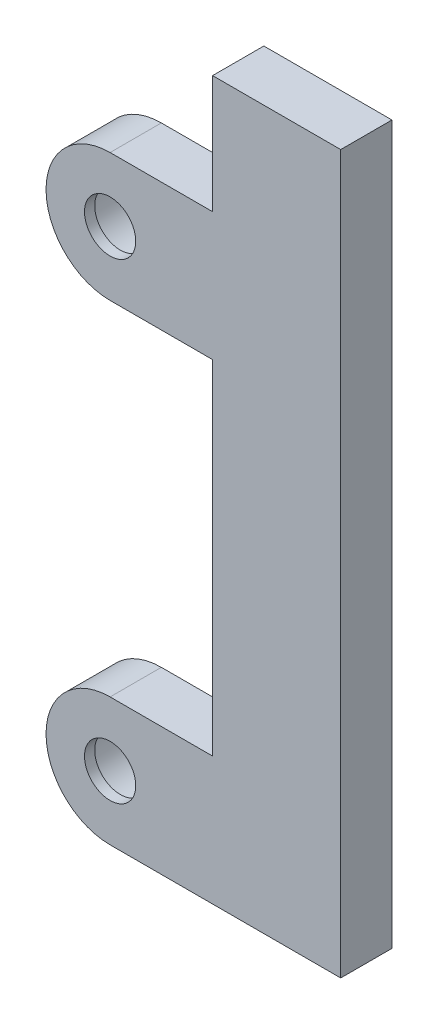
ISO-10303-21;
HEADER;
FILE_DESCRIPTION(('STEP AP214'),'2;1');
FILE_NAME('part.step','',(''),(''),'','','');
FILE_SCHEMA(('AUTOMOTIVE_DESIGN { 1 0 10303 214 1 1 1 1 }'));
ENDSEC;
DATA;
#1=APPLICATION_CONTEXT('core data for automotive mechanical design processes');
#2=APPLICATION_PROTOCOL_DEFINITION('international standard','automotive_design',2000,#1);
#3=PRODUCT_CONTEXT('',#1,'mechanical');
#4=PRODUCT('Part','Part','',(#3));
#5=PRODUCT_RELATED_PRODUCT_CATEGORY('part','',(#4));
#6=PRODUCT_DEFINITION_FORMATION('','',#4);
#7=PRODUCT_DEFINITION_CONTEXT('part definition',#1,'design');
#8=PRODUCT_DEFINITION('design','',#6,#7);
#9=PRODUCT_DEFINITION_SHAPE('','',#8);
#10=(LENGTH_UNIT() NAMED_UNIT(*) SI_UNIT(.MILLI.,.METRE.));
#11=(NAMED_UNIT(*) PLANE_ANGLE_UNIT() SI_UNIT($,.RADIAN.));
#12=(NAMED_UNIT(*) SI_UNIT($,.STERADIAN.) SOLID_ANGLE_UNIT());
#13=UNCERTAINTY_MEASURE_WITH_UNIT(LENGTH_MEASURE(1.E-05),#10,'distance_accuracy_value','');
#14=(GEOMETRIC_REPRESENTATION_CONTEXT(3) GLOBAL_UNCERTAINTY_ASSIGNED_CONTEXT((#13)) GLOBAL_UNIT_ASSIGNED_CONTEXT((#10,
#11,#12)) REPRESENTATION_CONTEXT('',''));
#15=CARTESIAN_POINT('',(0.,0.,0.));
#16=DIRECTION('',(0.,0.,1.));
#17=DIRECTION('',(1.,0.,0.));
#18=AXIS2_PLACEMENT_3D('',#15,#16,#17);
#19=CARTESIAN_POINT('',(0.,0.,-10.));
#20=DIRECTION('',(0.,0.,1.));
#21=DIRECTION('',(-1.,0.,0.));
#22=AXIS2_PLACEMENT_3D('',#19,#20,#21);
#23=CYLINDRICAL_SURFACE('',#22,5.);
#24=CARTESIAN_POINT('',(0.,0.,0.));
#25=DIRECTION('',(0.,0.,1.));
#26=DIRECTION('',(1.,0.,0.));
#27=AXIS2_PLACEMENT_3D('',#24,#25,#26);
#28=CIRCLE('',#27,5.);
#29=CARTESIAN_POINT('',(5.,0.,0.));
#30=VERTEX_POINT('',#29);
#31=EDGE_CURVE('E154',#30,#30,#28,.T.);
#32=ORIENTED_EDGE('',*,*,#31,.T.);
#33=EDGE_LOOP('',(#32));
#34=FACE_BOUND('',#33,.T.);
#35=CARTESIAN_POINT('',(0.,0.,-2.));
#36=DIRECTION('',(0.,0.,1.));
#37=DIRECTION('',(1.,0.,0.));
#38=AXIS2_PLACEMENT_3D('',#35,#36,#37);
#39=CIRCLE('',#38,5.);
#40=CARTESIAN_POINT('',(5.,0.,-2.));
#41=VERTEX_POINT('',#40);
#42=EDGE_CURVE('E43',#41,#41,#39,.T.);
#43=ORIENTED_EDGE('',*,*,#42,.F.);
#44=EDGE_LOOP('',(#43));
#45=FACE_BOUND('',#44,.T.);
#46=ADVANCED_FACE('F39',(#34,#45),#23,.F.);
#47=CARTESIAN_POINT('',(0.,92.,-10.));
#48=DIRECTION('',(0.,0.,1.));
#49=DIRECTION('',(-1.,0.,0.));
#50=AXIS2_PLACEMENT_3D('',#47,#48,#49);
#51=CYLINDRICAL_SURFACE('',#50,5.);
#52=CARTESIAN_POINT('',(0.,92.,0.));
#53=DIRECTION('',(0.,0.,1.));
#54=DIRECTION('',(1.,0.,0.));
#55=AXIS2_PLACEMENT_3D('',#52,#53,#54);
#56=CIRCLE('',#55,5.);
#57=CARTESIAN_POINT('',(5.,92.,0.));
#58=VERTEX_POINT('',#57);
#59=EDGE_CURVE('E195',#58,#58,#56,.T.);
#60=ORIENTED_EDGE('',*,*,#59,.T.);
#61=EDGE_LOOP('',(#60));
#62=FACE_BOUND('',#61,.T.);
#63=CARTESIAN_POINT('',(0.,92.,-2.));
#64=DIRECTION('',(0.,0.,1.));
#65=DIRECTION('',(1.,0.,0.));
#66=AXIS2_PLACEMENT_3D('',#63,#64,#65);
#67=CIRCLE('',#66,5.);
#68=CARTESIAN_POINT('',(5.,92.,-2.));
#69=VERTEX_POINT('',#68);
#70=EDGE_CURVE('E189',#69,#69,#67,.T.);
#71=ORIENTED_EDGE('',*,*,#70,.F.);
#72=EDGE_LOOP('',(#71));
#73=FACE_BOUND('',#72,.T.);
#74=ADVANCED_FACE('F256',(#62,#73),#51,.F.);
#75=CARTESIAN_POINT('',(0.,92.,-10.));
#76=DIRECTION('',(0.,0.,-1.));
#77=DIRECTION('',(1.,0.,0.));
#78=AXIS2_PLACEMENT_3D('',#75,#76,#77);
#79=PLANE('',#78);
#80=CARTESIAN_POINT('',(0.,92.,-10.));
#81=DIRECTION('',(0.,0.,1.));
#82=DIRECTION('',(1.,0.,0.));
#83=AXIS2_PLACEMENT_3D('',#80,#81,#82);
#84=CIRCLE('',#83,7.5);
#85=CARTESIAN_POINT('',(7.5,92.,-10.));
#86=VERTEX_POINT('',#85);
#87=EDGE_CURVE('E197',#86,#86,#84,.T.);
#88=ORIENTED_EDGE('',*,*,#87,.T.);
#89=EDGE_LOOP('',(#88));
#90=FACE_BOUND('',#89,.T.);
#91=CARTESIAN_POINT('',(0.,0.,-10.));
#92=DIRECTION('',(0.,0.,1.));
#93=DIRECTION('',(1.,0.,0.));
#94=AXIS2_PLACEMENT_3D('',#91,#92,#93);
#95=CIRCLE('',#94,7.5);
#96=CARTESIAN_POINT('',(7.5,0.,-10.));
#97=VERTEX_POINT('',#96);
#98=EDGE_CURVE('E205',#97,#97,#95,.T.);
#99=ORIENTED_EDGE('',*,*,#98,.T.);
#100=EDGE_LOOP('',(#99));
#101=FACE_BOUND('',#100,.T.);
#102=CARTESIAN_POINT('',(0.,92.,-10.));
#103=DIRECTION('',(0.,0.,1.));
#104=DIRECTION('',(1.,0.,0.));
#105=AXIS2_PLACEMENT_3D('',#102,#103,#104);
#106=CIRCLE('',#105,12.5);
#107=CARTESIAN_POINT('',(0.,104.5,-10.));
#108=VERTEX_POINT('',#107);
#109=CARTESIAN_POINT('',(0.,79.5,-10.));
#110=VERTEX_POINT('',#109);
#111=EDGE_CURVE('E177',#108,#110,#106,.T.);
#112=ORIENTED_EDGE('',*,*,#111,.F.);
#113=DIRECTION('',(-1.,0.,0.));
#114=VECTOR('',#113,1.);
#115=CARTESIAN_POINT('',(0.,104.5,-10.));
#116=LINE('',#115,#114);
#117=CARTESIAN_POINT('',(20.,104.5,-10.));
#118=VERTEX_POINT('',#117);
#119=EDGE_CURVE('E145',#118,#108,#116,.T.);
#120=ORIENTED_EDGE('',*,*,#119,.F.);
#121=DIRECTION('',(0.,-1.,0.));
#122=VECTOR('',#121,1.);
#123=CARTESIAN_POINT('',(20.,104.5,-10.));
#124=LINE('',#123,#122);
#125=CARTESIAN_POINT('',(20.,127.5,-10.));
#126=VERTEX_POINT('',#125);
#127=EDGE_CURVE('E126',#126,#118,#124,.T.);
#128=ORIENTED_EDGE('',*,*,#127,.F.);
#129=DIRECTION('',(-1.,0.,0.));
#130=VECTOR('',#129,1.);
#131=CARTESIAN_POINT('',(20.,127.5,-10.));
#132=LINE('',#131,#130);
#133=CARTESIAN_POINT('',(45.,127.5,-10.));
#134=VERTEX_POINT('',#133);
#135=EDGE_CURVE('E136',#134,#126,#132,.T.);
#136=ORIENTED_EDGE('',*,*,#135,.F.);
#137=DIRECTION('',(0.,1.,0.));
#138=VECTOR('',#137,1.);
#139=CARTESIAN_POINT('',(45.,127.5,-10.));
#140=LINE('',#139,#138);
#141=CARTESIAN_POINT('',(45.,-12.5,-10.));
#142=VERTEX_POINT('',#141);
#143=EDGE_CURVE('E141',#142,#134,#140,.T.);
#144=ORIENTED_EDGE('',*,*,#143,.F.);
#145=DIRECTION('',(1.,0.,0.));
#146=VECTOR('',#145,1.);
#147=CARTESIAN_POINT('',(45.,-12.5,-10.));
#148=LINE('',#147,#146);
#149=CARTESIAN_POINT('',(0.,-12.5,-10.));
#150=VERTEX_POINT('',#149);
#151=EDGE_CURVE('E226',#150,#142,#148,.T.);
#152=ORIENTED_EDGE('',*,*,#151,.F.);
#153=CARTESIAN_POINT('',(0.,0.,-10.));
#154=DIRECTION('',(0.,0.,1.));
#155=DIRECTION('',(1.,0.,0.));
#156=AXIS2_PLACEMENT_3D('',#153,#154,#155);
#157=CIRCLE('',#156,12.5);
#158=CARTESIAN_POINT('',(0.,12.5,-10.));
#159=VERTEX_POINT('',#158);
#160=EDGE_CURVE('E223',#159,#150,#157,.T.);
#161=ORIENTED_EDGE('',*,*,#160,.F.);
#162=DIRECTION('',(-1.,0.,0.));
#163=VECTOR('',#162,1.);
#164=CARTESIAN_POINT('',(0.,12.5,-10.));
#165=LINE('',#164,#163);
#166=CARTESIAN_POINT('',(20.,12.5,-10.));
#167=VERTEX_POINT('',#166);
#168=EDGE_CURVE('E220',#167,#159,#165,.T.);
#169=ORIENTED_EDGE('',*,*,#168,.F.);
#170=DIRECTION('',(0.,-1.,0.));
#171=VECTOR('',#170,1.);
#172=CARTESIAN_POINT('',(20.,79.5,-10.));
#173=LINE('',#172,#171);
#174=CARTESIAN_POINT('',(20.,79.5,-10.));
#175=VERTEX_POINT('',#174);
#176=EDGE_CURVE('E217',#175,#167,#173,.T.);
#177=ORIENTED_EDGE('',*,*,#176,.F.);
#178=DIRECTION('',(1.,0.,0.));
#179=VECTOR('',#178,1.);
#180=CARTESIAN_POINT('',(0.,79.5,-10.));
#181=LINE('',#180,#179);
#182=EDGE_CURVE('E215',#110,#175,#181,.T.);
#183=ORIENTED_EDGE('',*,*,#182,.F.);
#184=EDGE_LOOP('',(#112,#120,#128,#136,#144,#152,#161,#169,#177,#183));
#185=FACE_BOUND('',#184,.T.);
#186=ADVANCED_FACE('F144',(#90,#101,#185),#79,.T.);
#187=CARTESIAN_POINT('',(0.,92.,0.));
#188=DIRECTION('',(0.,0.,-1.));
#189=DIRECTION('',(1.,0.,0.));
#190=AXIS2_PLACEMENT_3D('',#187,#188,#189);
#191=PLANE('',#190);
#192=CARTESIAN_POINT('',(0.,92.,0.));
#193=DIRECTION('',(0.,0.,1.));
#194=DIRECTION('',(1.,0.,0.));
#195=AXIS2_PLACEMENT_3D('',#192,#193,#194);
#196=CIRCLE('',#195,12.5);
#197=CARTESIAN_POINT('',(0.,104.5,0.));
#198=VERTEX_POINT('',#197);
#199=CARTESIAN_POINT('',(0.,79.5,0.));
#200=VERTEX_POINT('',#199);
#201=EDGE_CURVE('E150',#198,#200,#196,.T.);
#202=ORIENTED_EDGE('',*,*,#201,.T.);
#203=DIRECTION('',(1.,0.,0.));
#204=VECTOR('',#203,1.);
#205=CARTESIAN_POINT('',(0.,79.5,0.));
#206=LINE('',#205,#204);
#207=CARTESIAN_POINT('',(20.,79.5,0.));
#208=VERTEX_POINT('',#207);
#209=EDGE_CURVE('E153',#200,#208,#206,.T.);
#210=ORIENTED_EDGE('',*,*,#209,.T.);
#211=DIRECTION('',(0.,-1.,0.));
#212=VECTOR('',#211,1.);
#213=CARTESIAN_POINT('',(20.,79.5,0.));
#214=LINE('',#213,#212);
#215=CARTESIAN_POINT('',(20.,12.5,0.));
#216=VERTEX_POINT('',#215);
#217=EDGE_CURVE('E157',#208,#216,#214,.T.);
#218=ORIENTED_EDGE('',*,*,#217,.T.);
#219=DIRECTION('',(-1.,0.,0.));
#220=VECTOR('',#219,1.);
#221=CARTESIAN_POINT('',(0.,12.5,0.));
#222=LINE('',#221,#220);
#223=CARTESIAN_POINT('',(0.,12.5,0.));
#224=VERTEX_POINT('',#223);
#225=EDGE_CURVE('E160',#216,#224,#222,.T.);
#226=ORIENTED_EDGE('',*,*,#225,.T.);
#227=CARTESIAN_POINT('',(0.,0.,0.));
#228=DIRECTION('',(0.,0.,1.));
#229=DIRECTION('',(1.,0.,0.));
#230=AXIS2_PLACEMENT_3D('',#227,#228,#229);
#231=CIRCLE('',#230,12.5);
#232=CARTESIAN_POINT('',(0.,-12.5,0.));
#233=VERTEX_POINT('',#232);
#234=EDGE_CURVE('E163',#224,#233,#231,.T.);
#235=ORIENTED_EDGE('',*,*,#234,.T.);
#236=DIRECTION('',(1.,0.,0.));
#237=VECTOR('',#236,1.);
#238=CARTESIAN_POINT('',(45.,-12.5,0.));
#239=LINE('',#238,#237);
#240=CARTESIAN_POINT('',(45.,-12.5,0.));
#241=VERTEX_POINT('',#240);
#242=EDGE_CURVE('E166',#233,#241,#239,.T.);
#243=ORIENTED_EDGE('',*,*,#242,.T.);
#244=DIRECTION('',(0.,1.,0.));
#245=VECTOR('',#244,1.);
#246=CARTESIAN_POINT('',(45.,127.5,0.));
#247=LINE('',#246,#245);
#248=CARTESIAN_POINT('',(45.,127.5,0.));
#249=VERTEX_POINT('',#248);
#250=EDGE_CURVE('E169',#241,#249,#247,.T.);
#251=ORIENTED_EDGE('',*,*,#250,.T.);
#252=DIRECTION('',(-1.,0.,0.));
#253=VECTOR('',#252,1.);
#254=CARTESIAN_POINT('',(20.,127.5,0.));
#255=LINE('',#254,#253);
#256=CARTESIAN_POINT('',(20.,127.5,0.));
#257=VERTEX_POINT('',#256);
#258=EDGE_CURVE('E172',#249,#257,#255,.T.);
#259=ORIENTED_EDGE('',*,*,#258,.T.);
#260=DIRECTION('',(0.,-1.,0.));
#261=VECTOR('',#260,1.);
#262=CARTESIAN_POINT('',(20.,104.5,0.));
#263=LINE('',#262,#261);
#264=CARTESIAN_POINT('',(20.,104.5,0.));
#265=VERTEX_POINT('',#264);
#266=EDGE_CURVE('E129',#257,#265,#263,.T.);
#267=ORIENTED_EDGE('',*,*,#266,.T.);
#268=DIRECTION('',(-1.,0.,0.));
#269=VECTOR('',#268,1.);
#270=CARTESIAN_POINT('',(0.,104.5,0.));
#271=LINE('',#270,#269);
#272=EDGE_CURVE('E175',#265,#198,#271,.T.);
#273=ORIENTED_EDGE('',*,*,#272,.T.);
#274=EDGE_LOOP('',(#202,#210,#218,#226,#235,#243,#251,#259,#267,#273));
#275=FACE_BOUND('',#274,.T.);
#276=ORIENTED_EDGE('',*,*,#31,.F.);
#277=EDGE_LOOP('',(#276));
#278=FACE_BOUND('',#277,.T.);
#279=ORIENTED_EDGE('',*,*,#59,.F.);
#280=EDGE_LOOP('',(#279));
#281=FACE_BOUND('',#280,.T.);
#282=ADVANCED_FACE('F254',(#275,#278,#281),#191,.F.);
#283=CARTESIAN_POINT('',(0.,92.,-10.));
#284=DIRECTION('',(0.,0.,1.));
#285=DIRECTION('',(-1.,0.,0.));
#286=AXIS2_PLACEMENT_3D('',#283,#284,#285);
#287=CYLINDRICAL_SURFACE('',#286,12.5);
#288=ORIENTED_EDGE('',*,*,#201,.F.);
#289=DIRECTION('',(0.,0.,1.));
#290=VECTOR('',#289,1.);
#291=CARTESIAN_POINT('',(0.,104.5,-10.));
#292=LINE('',#291,#290);
#293=EDGE_CURVE('E58',#108,#198,#292,.T.);
#294=ORIENTED_EDGE('',*,*,#293,.F.);
#295=ORIENTED_EDGE('',*,*,#111,.T.);
#296=DIRECTION('',(0.,0.,1.));
#297=VECTOR('',#296,1.);
#298=CARTESIAN_POINT('',(0.,79.5,-10.));
#299=LINE('',#298,#297);
#300=EDGE_CURVE('E12',#110,#200,#299,.T.);
#301=ORIENTED_EDGE('',*,*,#300,.T.);
#302=EDGE_LOOP('',(#288,#294,#295,#301));
#303=FACE_BOUND('',#302,.T.);
#304=ADVANCED_FACE('F41',(#303),#287,.T.);
#305=CARTESIAN_POINT('',(0.,79.5,-10.));
#306=DIRECTION('',(0.,1.,0.));
#307=DIRECTION('',(0.,0.,-1.));
#308=AXIS2_PLACEMENT_3D('',#305,#306,#307);
#309=PLANE('',#308);
#310=ORIENTED_EDGE('',*,*,#209,.F.);
#311=ORIENTED_EDGE('',*,*,#300,.F.);
#312=ORIENTED_EDGE('',*,*,#182,.T.);
#313=DIRECTION('',(0.,0.,1.));
#314=VECTOR('',#313,1.);
#315=CARTESIAN_POINT('',(20.,79.5,-10.));
#316=LINE('',#315,#314);
#317=EDGE_CURVE('E49',#175,#208,#316,.T.);
#318=ORIENTED_EDGE('',*,*,#317,.T.);
#319=EDGE_LOOP('',(#310,#311,#312,#318));
#320=FACE_BOUND('',#319,.T.);
#321=ADVANCED_FACE('F247',(#320),#309,.F.);
#322=CARTESIAN_POINT('',(20.,79.5,-10.));
#323=DIRECTION('',(1.,0.,0.));
#324=DIRECTION('',(0.,1.,0.));
#325=AXIS2_PLACEMENT_3D('',#322,#323,#324);
#326=PLANE('',#325);
#327=ORIENTED_EDGE('',*,*,#217,.F.);
#328=ORIENTED_EDGE('',*,*,#317,.F.);
#329=ORIENTED_EDGE('',*,*,#176,.T.);
#330=DIRECTION('',(0.,0.,1.));
#331=VECTOR('',#330,1.);
#332=CARTESIAN_POINT('',(20.,12.5,-10.));
#333=LINE('',#332,#331);
#334=EDGE_CURVE('E187',#167,#216,#333,.T.);
#335=ORIENTED_EDGE('',*,*,#334,.T.);
#336=EDGE_LOOP('',(#327,#328,#329,#335));
#337=FACE_BOUND('',#336,.T.);
#338=ADVANCED_FACE('F246',(#337),#326,.F.);
#339=CARTESIAN_POINT('',(0.,12.5,-10.));
#340=DIRECTION('',(0.,-1.,0.));
#341=DIRECTION('',(0.,0.,1.));
#342=AXIS2_PLACEMENT_3D('',#339,#340,#341);
#343=PLANE('',#342);
#344=ORIENTED_EDGE('',*,*,#225,.F.);
#345=ORIENTED_EDGE('',*,*,#334,.F.);
#346=ORIENTED_EDGE('',*,*,#168,.T.);
#347=DIRECTION('',(0.,0.,1.));
#348=VECTOR('',#347,1.);
#349=CARTESIAN_POINT('',(0.,12.5,-10.));
#350=LINE('',#349,#348);
#351=EDGE_CURVE('E185',#159,#224,#350,.T.);
#352=ORIENTED_EDGE('',*,*,#351,.T.);
#353=EDGE_LOOP('',(#344,#345,#346,#352));
#354=FACE_BOUND('',#353,.T.);
#355=ADVANCED_FACE('F242',(#354),#343,.F.);
#356=CARTESIAN_POINT('',(0.,0.,-10.));
#357=DIRECTION('',(0.,0.,1.));
#358=DIRECTION('',(-1.,0.,0.));
#359=AXIS2_PLACEMENT_3D('',#356,#357,#358);
#360=CYLINDRICAL_SURFACE('',#359,12.5);
#361=ORIENTED_EDGE('',*,*,#234,.F.);
#362=ORIENTED_EDGE('',*,*,#351,.F.);
#363=ORIENTED_EDGE('',*,*,#160,.T.);
#364=DIRECTION('',(0.,0.,1.));
#365=VECTOR('',#364,1.);
#366=CARTESIAN_POINT('',(0.,-12.5,-10.));
#367=LINE('',#366,#365);
#368=EDGE_CURVE('E183',#150,#233,#367,.T.);
#369=ORIENTED_EDGE('',*,*,#368,.T.);
#370=EDGE_LOOP('',(#361,#362,#363,#369));
#371=FACE_BOUND('',#370,.T.);
#372=ADVANCED_FACE('F239',(#371),#360,.T.);
#373=CARTESIAN_POINT('',(45.,-12.5,-10.));
#374=DIRECTION('',(0.,1.,0.));
#375=DIRECTION('',(-1.,0.,0.));
#376=AXIS2_PLACEMENT_3D('',#373,#374,#375);
#377=PLANE('',#376);
#378=ORIENTED_EDGE('',*,*,#242,.F.);
#379=ORIENTED_EDGE('',*,*,#368,.F.);
#380=ORIENTED_EDGE('',*,*,#151,.T.);
#381=DIRECTION('',(0.,0.,1.));
#382=VECTOR('',#381,1.);
#383=CARTESIAN_POINT('',(45.,-12.5,-10.));
#384=LINE('',#383,#382);
#385=EDGE_CURVE('E181',#142,#241,#384,.T.);
#386=ORIENTED_EDGE('',*,*,#385,.T.);
#387=EDGE_LOOP('',(#378,#379,#380,#386));
#388=FACE_BOUND('',#387,.T.);
#389=ADVANCED_FACE('F236',(#388),#377,.F.);
#390=CARTESIAN_POINT('',(45.,127.5,-10.));
#391=DIRECTION('',(-1.,0.,0.));
#392=DIRECTION('',(0.,-1.,0.));
#393=AXIS2_PLACEMENT_3D('',#390,#391,#392);
#394=PLANE('',#393);
#395=ORIENTED_EDGE('',*,*,#250,.F.);
#396=ORIENTED_EDGE('',*,*,#385,.F.);
#397=ORIENTED_EDGE('',*,*,#143,.T.);
#398=DIRECTION('',(0.,0.,1.));
#399=VECTOR('',#398,1.);
#400=CARTESIAN_POINT('',(45.,127.5,-10.));
#401=LINE('',#400,#399);
#402=EDGE_CURVE('E133',#134,#249,#401,.T.);
#403=ORIENTED_EDGE('',*,*,#402,.T.);
#404=EDGE_LOOP('',(#395,#396,#397,#403));
#405=FACE_BOUND('',#404,.T.);
#406=ADVANCED_FACE('F230',(#405),#394,.F.);
#407=CARTESIAN_POINT('',(20.,127.5,-10.));
#408=DIRECTION('',(0.,-1.,0.));
#409=DIRECTION('',(0.,0.,1.));
#410=AXIS2_PLACEMENT_3D('',#407,#408,#409);
#411=PLANE('',#410);
#412=ORIENTED_EDGE('',*,*,#258,.F.);
#413=ORIENTED_EDGE('',*,*,#402,.F.);
#414=ORIENTED_EDGE('',*,*,#135,.T.);
#415=DIRECTION('',(0.,0.,1.));
#416=VECTOR('',#415,1.);
#417=CARTESIAN_POINT('',(20.,127.5,-10.));
#418=LINE('',#417,#416);
#419=EDGE_CURVE('E122',#126,#257,#418,.T.);
#420=ORIENTED_EDGE('',*,*,#419,.T.);
#421=EDGE_LOOP('',(#412,#413,#414,#420));
#422=FACE_BOUND('',#421,.T.);
#423=ADVANCED_FACE('F137',(#422),#411,.F.);
#424=CARTESIAN_POINT('',(20.,104.5,-10.));
#425=DIRECTION('',(1.,0.,0.));
#426=DIRECTION('',(0.,0.,1.));
#427=AXIS2_PLACEMENT_3D('',#424,#425,#426);
#428=PLANE('',#427);
#429=ORIENTED_EDGE('',*,*,#266,.F.);
#430=ORIENTED_EDGE('',*,*,#419,.F.);
#431=ORIENTED_EDGE('',*,*,#127,.T.);
#432=DIRECTION('',(0.,0.,1.));
#433=VECTOR('',#432,1.);
#434=CARTESIAN_POINT('',(20.,104.5,-10.));
#435=LINE('',#434,#433);
#436=EDGE_CURVE('E92',#118,#265,#435,.T.);
#437=ORIENTED_EDGE('',*,*,#436,.T.);
#438=EDGE_LOOP('',(#429,#430,#431,#437));
#439=FACE_BOUND('',#438,.T.);
#440=ADVANCED_FACE('F124',(#439),#428,.F.);
#441=CARTESIAN_POINT('',(0.,104.5,-10.));
#442=DIRECTION('',(0.,-1.,0.));
#443=DIRECTION('',(0.,0.,1.));
#444=AXIS2_PLACEMENT_3D('',#441,#442,#443);
#445=PLANE('',#444);
#446=ORIENTED_EDGE('',*,*,#272,.F.);
#447=ORIENTED_EDGE('',*,*,#436,.F.);
#448=ORIENTED_EDGE('',*,*,#119,.T.);
#449=ORIENTED_EDGE('',*,*,#293,.T.);
#450=EDGE_LOOP('',(#446,#447,#448,#449));
#451=FACE_BOUND('',#450,.T.);
#452=ADVANCED_FACE('F273',(#451),#445,.F.);
#453=CARTESIAN_POINT('',(0.,92.,21.2132034355964));
#454=DIRECTION('',(0.,0.,-1.));
#455=DIRECTION('',(1.,0.,0.));
#456=AXIS2_PLACEMENT_3D('',#453,#454,#455);
#457=CYLINDRICAL_SURFACE('',#456,7.5);
#458=CARTESIAN_POINT('',(0.,92.,-2.));
#459=DIRECTION('',(0.,0.,1.));
#460=DIRECTION('',(1.,0.,0.));
#461=AXIS2_PLACEMENT_3D('',#458,#459,#460);
#462=CIRCLE('',#461,7.5);
#463=CARTESIAN_POINT('',(7.5,92.,-2.));
#464=VERTEX_POINT('',#463);
#465=EDGE_CURVE('E191',#464,#464,#462,.F.);
#466=ORIENTED_EDGE('',*,*,#465,.F.);
#467=EDGE_LOOP('',(#466));
#468=FACE_BOUND('',#467,.T.);
#469=ORIENTED_EDGE('',*,*,#87,.F.);
#470=EDGE_LOOP('',(#469));
#471=FACE_BOUND('',#470,.T.);
#472=ADVANCED_FACE('F276',(#468,#471),#457,.F.);
#473=CARTESIAN_POINT('',(0.,92.,-2.));
#474=DIRECTION('',(0.,0.,-1.));
#475=DIRECTION('',(1.,0.,0.));
#476=AXIS2_PLACEMENT_3D('',#473,#474,#475);
#477=PLANE('',#476);
#478=ORIENTED_EDGE('',*,*,#70,.T.);
#479=EDGE_LOOP('',(#478));
#480=FACE_BOUND('',#479,.T.);
#481=ORIENTED_EDGE('',*,*,#465,.T.);
#482=EDGE_LOOP('',(#481));
#483=FACE_BOUND('',#482,.T.);
#484=ADVANCED_FACE('F322',(#480,#483),#477,.T.);
#485=CARTESIAN_POINT('',(0.,0.,21.2132034355964));
#486=DIRECTION('',(0.,0.,-1.));
#487=DIRECTION('',(1.,0.,0.));
#488=AXIS2_PLACEMENT_3D('',#485,#486,#487);
#489=CYLINDRICAL_SURFACE('',#488,7.5);
#490=CARTESIAN_POINT('',(0.,0.,-2.));
#491=DIRECTION('',(0.,0.,1.));
#492=DIRECTION('',(1.,0.,0.));
#493=AXIS2_PLACEMENT_3D('',#490,#491,#492);
#494=CIRCLE('',#493,7.5);
#495=CARTESIAN_POINT('',(7.5,0.,-2.));
#496=VERTEX_POINT('',#495);
#497=EDGE_CURVE('E202',#496,#496,#494,.F.);
#498=ORIENTED_EDGE('',*,*,#497,.F.);
#499=EDGE_LOOP('',(#498));
#500=FACE_BOUND('',#499,.T.);
#501=ORIENTED_EDGE('',*,*,#98,.F.);
#502=EDGE_LOOP('',(#501));
#503=FACE_BOUND('',#502,.T.);
#504=ADVANCED_FACE('F330',(#500,#503),#489,.F.);
#505=CARTESIAN_POINT('',(0.,92.,-2.));
#506=DIRECTION('',(0.,0.,-1.));
#507=DIRECTION('',(1.,0.,0.));
#508=AXIS2_PLACEMENT_3D('',#505,#506,#507);
#509=PLANE('',#508);
#510=ORIENTED_EDGE('',*,*,#42,.T.);
#511=EDGE_LOOP('',(#510));
#512=FACE_BOUND('',#511,.T.);
#513=ORIENTED_EDGE('',*,*,#497,.T.);
#514=EDGE_LOOP('',(#513));
#515=FACE_BOUND('',#514,.T.);
#516=ADVANCED_FACE('F337',(#512,#515),#509,.T.);
#517=CLOSED_SHELL('',(#46,#74,#186,#282,#304,#321,#338,#355,#372,#389,#406,#423,#440,#452,#472,
#484,#504,#516));
#518=MANIFOLD_SOLID_BREP('B2',#517);
#519=ADVANCED_BREP_SHAPE_REPRESENTATION('',(#18,#518),#14);
#520=SHAPE_DEFINITION_REPRESENTATION(#9,#519);
ENDSEC;
END-ISO-10303-21;
